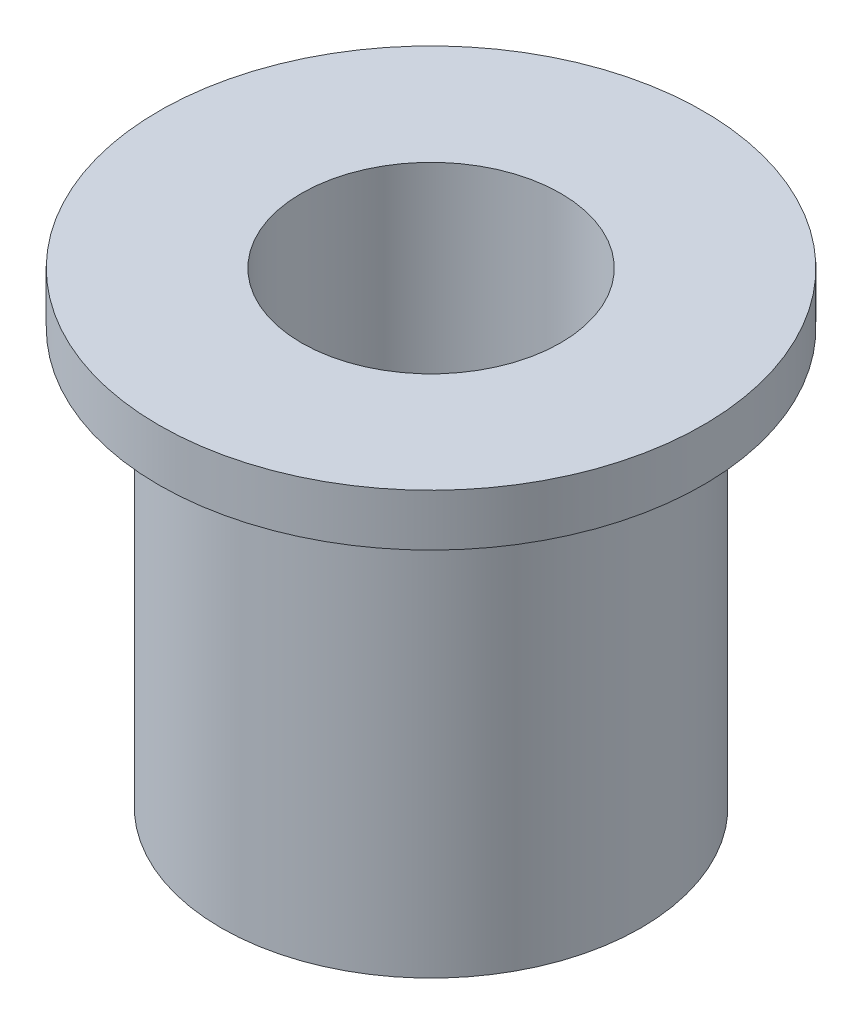
ISO-10303-21;
HEADER;
FILE_DESCRIPTION(('STEP AP214'),'2;1');
FILE_NAME('part.step','',(''),(''),'','','');
FILE_SCHEMA(('AUTOMOTIVE_DESIGN { 1 0 10303 214 1 1 1 1 }'));
ENDSEC;
DATA;
#1=APPLICATION_CONTEXT('core data for automotive mechanical design processes');
#2=APPLICATION_PROTOCOL_DEFINITION('international standard','automotive_design',2000,#1);
#3=PRODUCT_CONTEXT('',#1,'mechanical');
#4=PRODUCT('Part','Part','',(#3));
#5=PRODUCT_RELATED_PRODUCT_CATEGORY('part','',(#4));
#6=PRODUCT_DEFINITION_FORMATION('','',#4);
#7=PRODUCT_DEFINITION_CONTEXT('part definition',#1,'design');
#8=PRODUCT_DEFINITION('design','',#6,#7);
#9=PRODUCT_DEFINITION_SHAPE('','',#8);
#10=(LENGTH_UNIT() NAMED_UNIT(*) SI_UNIT(.MILLI.,.METRE.));
#11=(NAMED_UNIT(*) PLANE_ANGLE_UNIT() SI_UNIT($,.RADIAN.));
#12=(NAMED_UNIT(*) SI_UNIT($,.STERADIAN.) SOLID_ANGLE_UNIT());
#13=UNCERTAINTY_MEASURE_WITH_UNIT(LENGTH_MEASURE(1.E-05),#10,'distance_accuracy_value','');
#14=(GEOMETRIC_REPRESENTATION_CONTEXT(3) GLOBAL_UNCERTAINTY_ASSIGNED_CONTEXT((#13)) GLOBAL_UNIT_ASSIGNED_CONTEXT((#10,
#11,#12)) REPRESENTATION_CONTEXT('',''));
#15=CARTESIAN_POINT('',(0.,0.,0.));
#16=DIRECTION('',(0.,0.,1.));
#17=DIRECTION('',(1.,0.,0.));
#18=AXIS2_PLACEMENT_3D('',#15,#16,#17);
#19=CARTESIAN_POINT('',(0.,0.,0.));
#20=DIRECTION('',(0.,1.,0.));
#21=DIRECTION('',(0.,0.,1.));
#22=AXIS2_PLACEMENT_3D('',#19,#20,#21);
#23=PLANE('',#22);
#24=CARTESIAN_POINT('',(0.,0.,0.));
#25=DIRECTION('',(0.,1.,0.));
#26=DIRECTION('',(0.,0.,1.));
#27=AXIS2_PLACEMENT_3D('',#24,#25,#26);
#28=CIRCLE('',#27,2.5);
#29=CARTESIAN_POINT('',(0.,0.,2.5));
#30=VERTEX_POINT('',#29);
#31=EDGE_CURVE('E57',#30,#30,#28,.T.);
#32=ORIENTED_EDGE('',*,*,#31,.T.);
#33=EDGE_LOOP('',(#32));
#34=FACE_BOUND('',#33,.T.);
#35=CARTESIAN_POINT('',(0.,0.,0.));
#36=DIRECTION('',(0.,-1.,0.));
#37=DIRECTION('',(0.,0.,-1.));
#38=AXIS2_PLACEMENT_3D('',#35,#36,#37);
#39=CIRCLE('',#38,3.1);
#40=CARTESIAN_POINT('',(0.,0.,-3.1));
#41=VERTEX_POINT('',#40);
#42=EDGE_CURVE('E74',#41,#41,#39,.T.);
#43=ORIENTED_EDGE('',*,*,#42,.T.);
#44=EDGE_LOOP('',(#43));
#45=FACE_BOUND('',#44,.T.);
#46=ADVANCED_FACE('F39',(#34,#45),#23,.F.);
#47=CARTESIAN_POINT('',(0.,9.,0.));
#48=DIRECTION('',(0.,-1.,0.));
#49=DIRECTION('',(0.,0.,-1.));
#50=AXIS2_PLACEMENT_3D('',#47,#48,#49);
#51=CYLINDRICAL_SURFACE('',#50,4.05);
#52=CARTESIAN_POINT('',(0.,0.,0.));
#53=DIRECTION('',(0.,1.,0.));
#54=DIRECTION('',(0.,0.,1.));
#55=AXIS2_PLACEMENT_3D('',#52,#53,#54);
#56=CIRCLE('',#55,4.05);
#57=CARTESIAN_POINT('',(0.,0.,4.05));
#58=VERTEX_POINT('',#57);
#59=EDGE_CURVE('E43',#58,#58,#56,.T.);
#60=ORIENTED_EDGE('',*,*,#59,.T.);
#61=EDGE_LOOP('',(#60));
#62=FACE_BOUND('',#61,.T.);
#63=CARTESIAN_POINT('',(0.,8.,0.));
#64=DIRECTION('',(0.,1.,0.));
#65=DIRECTION('',(0.,0.,1.));
#66=AXIS2_PLACEMENT_3D('',#63,#64,#65);
#67=CIRCLE('',#66,4.05);
#68=CARTESIAN_POINT('',(0.,8.,4.05));
#69=VERTEX_POINT('',#68);
#70=EDGE_CURVE('E10',#69,#69,#67,.T.);
#71=ORIENTED_EDGE('',*,*,#70,.F.);
#72=EDGE_LOOP('',(#71));
#73=FACE_BOUND('',#72,.T.);
#74=ADVANCED_FACE('F41',(#62,#73),#51,.T.);
#75=CARTESIAN_POINT('',(0.,9.,0.));
#76=DIRECTION('',(0.,1.,0.));
#77=DIRECTION('',(0.,0.,1.));
#78=AXIS2_PLACEMENT_3D('',#75,#76,#77);
#79=PLANE('',#78);
#80=CARTESIAN_POINT('',(0.,9.,0.));
#81=DIRECTION('',(0.,1.,0.));
#82=DIRECTION('',(0.,0.,1.));
#83=AXIS2_PLACEMENT_3D('',#80,#81,#82);
#84=CIRCLE('',#83,2.5);
#85=CARTESIAN_POINT('',(0.,9.,2.5));
#86=VERTEX_POINT('',#85);
#87=EDGE_CURVE('E51',#86,#86,#84,.T.);
#88=ORIENTED_EDGE('',*,*,#87,.F.);
#89=EDGE_LOOP('',(#88));
#90=FACE_BOUND('',#89,.T.);
#91=CARTESIAN_POINT('',(0.,9.,0.));
#92=DIRECTION('',(0.,1.,0.));
#93=DIRECTION('',(0.,0.,1.));
#94=AXIS2_PLACEMENT_3D('',#91,#92,#93);
#95=CIRCLE('',#94,5.25);
#96=CARTESIAN_POINT('',(0.,9.,5.25));
#97=VERTEX_POINT('',#96);
#98=EDGE_CURVE('E54',#97,#97,#95,.T.);
#99=ORIENTED_EDGE('',*,*,#98,.T.);
#100=EDGE_LOOP('',(#99));
#101=FACE_BOUND('',#100,.T.);
#102=ADVANCED_FACE('F100',(#90,#101),#79,.T.);
#103=CARTESIAN_POINT('',(0.,0.,0.));
#104=DIRECTION('',(0.,-1.,0.));
#105=DIRECTION('',(0.,0.,-1.));
#106=AXIS2_PLACEMENT_3D('',#103,#104,#105);
#107=CIRCLE('',#106,3.5);
#108=CARTESIAN_POINT('',(0.,0.,-3.5));
#109=VERTEX_POINT('',#108);
#110=EDGE_CURVE('E68',#109,#109,#107,.T.);
#111=ORIENTED_EDGE('',*,*,#110,.F.);
#112=EDGE_LOOP('',(#111));
#113=FACE_BOUND('',#112,.T.);
#114=ORIENTED_EDGE('',*,*,#59,.F.);
#115=EDGE_LOOP('',(#114));
#116=FACE_BOUND('',#115,.T.);
#117=ADVANCED_FACE('F96',(#113,#116),#23,.F.);
#118=CARTESIAN_POINT('',(0.,9.,0.));
#119=DIRECTION('',(0.,-1.,0.));
#120=DIRECTION('',(0.,0.,-1.));
#121=AXIS2_PLACEMENT_3D('',#118,#119,#120);
#122=CYLINDRICAL_SURFACE('',#121,2.5);
#123=ORIENTED_EDGE('',*,*,#87,.T.);
#124=EDGE_LOOP('',(#123));
#125=FACE_BOUND('',#124,.T.);
#126=ORIENTED_EDGE('',*,*,#31,.F.);
#127=EDGE_LOOP('',(#126));
#128=FACE_BOUND('',#127,.T.);
#129=ADVANCED_FACE('F99',(#125,#128),#122,.F.);
#130=CARTESIAN_POINT('',(0.,8.,0.));
#131=DIRECTION('',(0.,1.,0.));
#132=DIRECTION('',(0.,0.,1.));
#133=AXIS2_PLACEMENT_3D('',#130,#131,#132);
#134=PLANE('',#133);
#135=CARTESIAN_POINT('',(0.,8.,0.));
#136=DIRECTION('',(0.,1.,0.));
#137=DIRECTION('',(0.,0.,1.));
#138=AXIS2_PLACEMENT_3D('',#135,#136,#137);
#139=CIRCLE('',#138,5.25);
#140=CARTESIAN_POINT('',(0.,8.,5.25));
#141=VERTEX_POINT('',#140);
#142=EDGE_CURVE('E59',#141,#141,#139,.T.);
#143=ORIENTED_EDGE('',*,*,#142,.F.);
#144=EDGE_LOOP('',(#143));
#145=FACE_BOUND('',#144,.T.);
#146=ORIENTED_EDGE('',*,*,#70,.T.);
#147=EDGE_LOOP('',(#146));
#148=FACE_BOUND('',#147,.T.);
#149=ADVANCED_FACE('F118',(#145,#148),#134,.F.);
#150=CARTESIAN_POINT('',(0.,8.,0.));
#151=DIRECTION('',(0.,1.,0.));
#152=DIRECTION('',(0.,0.,1.));
#153=AXIS2_PLACEMENT_3D('',#150,#151,#152);
#154=CYLINDRICAL_SURFACE('',#153,5.25);
#155=ORIENTED_EDGE('',*,*,#142,.T.);
#156=EDGE_LOOP('',(#155));
#157=FACE_BOUND('',#156,.T.);
#158=ORIENTED_EDGE('',*,*,#98,.F.);
#159=EDGE_LOOP('',(#158));
#160=FACE_BOUND('',#159,.T.);
#161=ADVANCED_FACE('F92',(#157,#160),#154,.T.);
#162=CARTESIAN_POINT('',(0.,4.5,0.));
#163=DIRECTION('',(0.,-1.,0.));
#164=DIRECTION('',(0.,0.,-1.));
#165=AXIS2_PLACEMENT_3D('',#162,#163,#164);
#166=CYLINDRICAL_SURFACE('',#165,3.5);
#167=CARTESIAN_POINT('',(0.,4.5,0.));
#168=DIRECTION('',(0.,-1.,0.));
#169=DIRECTION('',(0.,0.,-1.));
#170=AXIS2_PLACEMENT_3D('',#167,#168,#169);
#171=CIRCLE('',#170,3.5);
#172=CARTESIAN_POINT('',(0.,4.5,-3.5));
#173=VERTEX_POINT('',#172);
#174=EDGE_CURVE('E66',#173,#173,#171,.T.);
#175=ORIENTED_EDGE('',*,*,#174,.F.);
#176=EDGE_LOOP('',(#175));
#177=FACE_BOUND('',#176,.T.);
#178=ORIENTED_EDGE('',*,*,#110,.T.);
#179=EDGE_LOOP('',(#178));
#180=FACE_BOUND('',#179,.T.);
#181=ADVANCED_FACE('F86',(#177,#180),#166,.F.);
#182=CARTESIAN_POINT('',(0.,4.5,0.));
#183=DIRECTION('',(0.,-1.,0.));
#184=DIRECTION('',(0.,0.,-1.));
#185=AXIS2_PLACEMENT_3D('',#182,#183,#184);
#186=PLANE('',#185);
#187=CARTESIAN_POINT('',(0.,4.5,0.));
#188=DIRECTION('',(0.,-1.,0.));
#189=DIRECTION('',(0.,0.,-1.));
#190=AXIS2_PLACEMENT_3D('',#187,#188,#189);
#191=CIRCLE('',#190,3.1);
#192=CARTESIAN_POINT('',(0.,4.5,-3.1));
#193=VERTEX_POINT('',#192);
#194=EDGE_CURVE('E71',#193,#193,#191,.T.);
#195=ORIENTED_EDGE('',*,*,#194,.F.);
#196=EDGE_LOOP('',(#195));
#197=FACE_BOUND('',#196,.T.);
#198=ORIENTED_EDGE('',*,*,#174,.T.);
#199=EDGE_LOOP('',(#198));
#200=FACE_BOUND('',#199,.T.);
#201=ADVANCED_FACE('F83',(#197,#200),#186,.T.);
#202=CARTESIAN_POINT('',(0.,4.5,0.));
#203=DIRECTION('',(0.,-1.,0.));
#204=DIRECTION('',(0.,0.,-1.));
#205=AXIS2_PLACEMENT_3D('',#202,#203,#204);
#206=CYLINDRICAL_SURFACE('',#205,3.1);
#207=ORIENTED_EDGE('',*,*,#194,.T.);
#208=EDGE_LOOP('',(#207));
#209=FACE_BOUND('',#208,.T.);
#210=ORIENTED_EDGE('',*,*,#42,.F.);
#211=EDGE_LOOP('',(#210));
#212=FACE_BOUND('',#211,.T.);
#213=ADVANCED_FACE('F80',(#209,#212),#206,.T.);
#214=CLOSED_SHELL('',(#46,#74,#102,#117,#129,#149,#161,#181,#201,#213));
#215=MANIFOLD_SOLID_BREP('B2',#214);
#216=ADVANCED_BREP_SHAPE_REPRESENTATION('',(#18,#215),#14);
#217=SHAPE_DEFINITION_REPRESENTATION(#9,#216);
ENDSEC;
END-ISO-10303-21;
